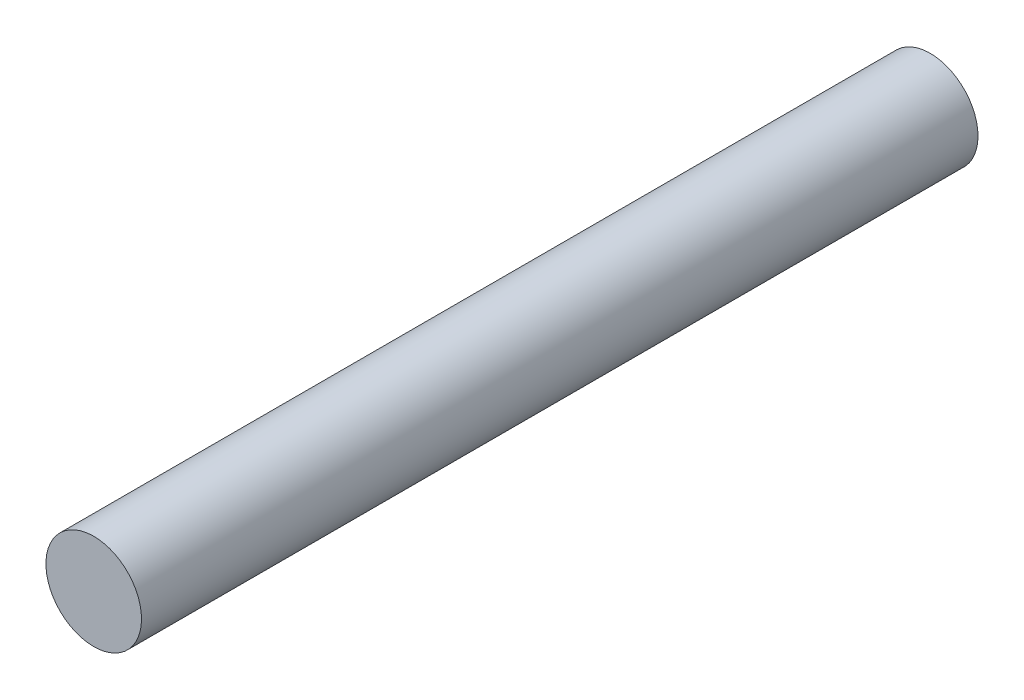
ISO-10303-21;
HEADER;
FILE_DESCRIPTION(('STEP AP214'),'2;1');
FILE_NAME('part.step','',(''),(''),'','','');
FILE_SCHEMA(('AUTOMOTIVE_DESIGN { 1 0 10303 214 1 1 1 1 }'));
ENDSEC;
DATA;
#1=APPLICATION_CONTEXT('core data for automotive mechanical design processes');
#2=APPLICATION_PROTOCOL_DEFINITION('international standard','automotive_design',2000,#1);
#3=PRODUCT_CONTEXT('',#1,'mechanical');
#4=PRODUCT('Part','Part','',(#3));
#5=PRODUCT_RELATED_PRODUCT_CATEGORY('part','',(#4));
#6=PRODUCT_DEFINITION_FORMATION('','',#4);
#7=PRODUCT_DEFINITION_CONTEXT('part definition',#1,'design');
#8=PRODUCT_DEFINITION('design','',#6,#7);
#9=PRODUCT_DEFINITION_SHAPE('','',#8);
#10=(LENGTH_UNIT() NAMED_UNIT(*) SI_UNIT(.MILLI.,.METRE.));
#11=(NAMED_UNIT(*) PLANE_ANGLE_UNIT() SI_UNIT($,.RADIAN.));
#12=(NAMED_UNIT(*) SI_UNIT($,.STERADIAN.) SOLID_ANGLE_UNIT());
#13=UNCERTAINTY_MEASURE_WITH_UNIT(LENGTH_MEASURE(1.E-05),#10,'distance_accuracy_value','');
#14=(GEOMETRIC_REPRESENTATION_CONTEXT(3) GLOBAL_UNCERTAINTY_ASSIGNED_CONTEXT((#13)) GLOBAL_UNIT_ASSIGNED_CONTEXT((#10,
#11,#12)) REPRESENTATION_CONTEXT('',''));
#15=CARTESIAN_POINT('',(0.,0.,0.));
#16=DIRECTION('',(0.,0.,1.));
#17=DIRECTION('',(1.,0.,0.));
#18=AXIS2_PLACEMENT_3D('',#15,#16,#17);
#19=CARTESIAN_POINT('',(0.,0.,70.));
#20=DIRECTION('',(0.,0.,-1.));
#21=DIRECTION('',(-1.,0.,0.));
#22=AXIS2_PLACEMENT_3D('',#19,#20,#21);
#23=CYLINDRICAL_SURFACE('',#22,4.);
#24=CARTESIAN_POINT('',(0.,0.,70.));
#25=DIRECTION('',(0.,0.,1.));
#26=DIRECTION('',(1.,0.,0.));
#27=AXIS2_PLACEMENT_3D('',#24,#25,#26);
#28=CIRCLE('',#27,4.);
#29=CARTESIAN_POINT('',(4.,0.,70.));
#30=VERTEX_POINT('',#29);
#31=EDGE_CURVE('E10',#30,#30,#28,.T.);
#32=ORIENTED_EDGE('',*,*,#31,.F.);
#33=EDGE_LOOP('',(#32));
#34=FACE_BOUND('',#33,.T.);
#35=CARTESIAN_POINT('',(0.,0.,0.));
#36=DIRECTION('',(0.,0.,1.));
#37=DIRECTION('',(1.,0.,0.));
#38=AXIS2_PLACEMENT_3D('',#35,#36,#37);
#39=CIRCLE('',#38,4.);
#40=CARTESIAN_POINT('',(4.,0.,0.));
#41=VERTEX_POINT('',#40);
#42=EDGE_CURVE('E37',#41,#41,#39,.T.);
#43=ORIENTED_EDGE('',*,*,#42,.T.);
#44=EDGE_LOOP('',(#43));
#45=FACE_BOUND('',#44,.T.);
#46=ADVANCED_FACE('F34',(#34,#45),#23,.T.);
#47=CARTESIAN_POINT('',(0.,0.,70.));
#48=DIRECTION('',(0.,0.,1.));
#49=DIRECTION('',(1.,0.,0.));
#50=AXIS2_PLACEMENT_3D('',#47,#48,#49);
#51=PLANE('',#50);
#52=ORIENTED_EDGE('',*,*,#31,.T.);
#53=EDGE_LOOP('',(#52));
#54=FACE_BOUND('',#53,.T.);
#55=ADVANCED_FACE('F63',(#54),#51,.T.);
#56=CARTESIAN_POINT('',(0.,0.,0.));
#57=DIRECTION('',(0.,0.,1.));
#58=DIRECTION('',(1.,0.,0.));
#59=AXIS2_PLACEMENT_3D('',#56,#57,#58);
#60=PLANE('',#59);
#61=CARTESIAN_POINT('',(0.,0.,0.));
#62=DIRECTION('',(0.,0.,-1.));
#63=DIRECTION('',(-1.,0.,0.));
#64=AXIS2_PLACEMENT_3D('',#61,#62,#63);
#65=CIRCLE('',#64,2.5);
#66=CARTESIAN_POINT('',(-2.5,0.,0.));
#67=VERTEX_POINT('',#66);
#68=EDGE_CURVE('E46',#67,#67,#65,.T.);
#69=ORIENTED_EDGE('',*,*,#68,.F.);
#70=EDGE_LOOP('',(#69));
#71=FACE_BOUND('',#70,.T.);
#72=ORIENTED_EDGE('',*,*,#42,.F.);
#73=EDGE_LOOP('',(#72));
#74=FACE_BOUND('',#73,.T.);
#75=ADVANCED_FACE('F57',(#71,#74),#60,.F.);
#76=CARTESIAN_POINT('',(0.,0.,6.));
#77=DIRECTION('',(0.,0.,-1.));
#78=DIRECTION('',(-1.,0.,0.));
#79=AXIS2_PLACEMENT_3D('',#76,#77,#78);
#80=CYLINDRICAL_SURFACE('',#79,2.5);
#81=CARTESIAN_POINT('',(0.,0.,6.));
#82=DIRECTION('',(0.,0.,-1.));
#83=DIRECTION('',(-1.,0.,0.));
#84=AXIS2_PLACEMENT_3D('',#81,#82,#83);
#85=CIRCLE('',#84,2.5);
#86=CARTESIAN_POINT('',(-2.5,0.,6.));
#87=VERTEX_POINT('',#86);
#88=EDGE_CURVE('E44',#87,#87,#85,.T.);
#89=ORIENTED_EDGE('',*,*,#88,.F.);
#90=EDGE_LOOP('',(#89));
#91=FACE_BOUND('',#90,.T.);
#92=ORIENTED_EDGE('',*,*,#68,.T.);
#93=EDGE_LOOP('',(#92));
#94=FACE_BOUND('',#93,.T.);
#95=ADVANCED_FACE('F54',(#91,#94),#80,.F.);
#96=CARTESIAN_POINT('',(0.,0.,6.));
#97=DIRECTION('',(0.,0.,-1.));
#98=DIRECTION('',(-1.,0.,0.));
#99=AXIS2_PLACEMENT_3D('',#96,#97,#98);
#100=PLANE('',#99);
#101=ORIENTED_EDGE('',*,*,#88,.T.);
#102=EDGE_LOOP('',(#101));
#103=FACE_BOUND('',#102,.T.);
#104=ADVANCED_FACE('F52',(#103),#100,.T.);
#105=CLOSED_SHELL('',(#46,#55,#75,#95,#104));
#106=MANIFOLD_SOLID_BREP('B2',#105);
#107=ADVANCED_BREP_SHAPE_REPRESENTATION('',(#18,#106),#14);
#108=SHAPE_DEFINITION_REPRESENTATION(#9,#107);
ENDSEC;
END-ISO-10303-21;
